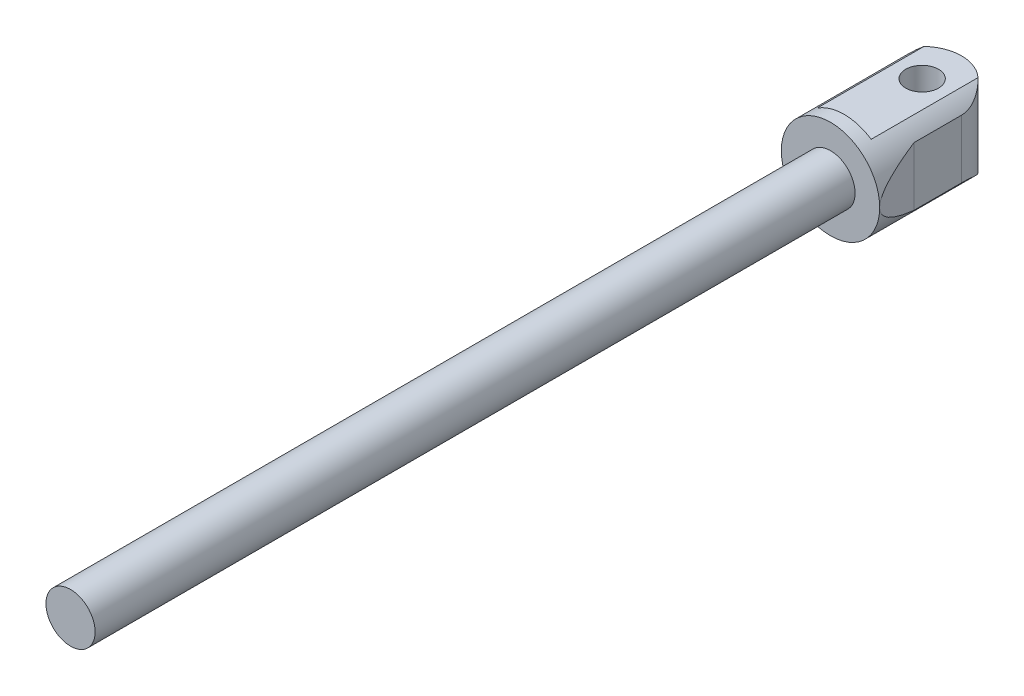
ISO-10303-21;
HEADER;
FILE_DESCRIPTION(('STEP AP214'),'2;1');
FILE_NAME('part.step','',(''),(''),'','','');
FILE_SCHEMA(('AUTOMOTIVE_DESIGN { 1 0 10303 214 1 1 1 1 }'));
ENDSEC;
DATA;
#1=APPLICATION_CONTEXT('core data for automotive mechanical design processes');
#2=APPLICATION_PROTOCOL_DEFINITION('international standard','automotive_design',2000,#1);
#3=PRODUCT_CONTEXT('',#1,'mechanical');
#4=PRODUCT('Part','Part','',(#3));
#5=PRODUCT_RELATED_PRODUCT_CATEGORY('part','',(#4));
#6=PRODUCT_DEFINITION_FORMATION('','',#4);
#7=PRODUCT_DEFINITION_CONTEXT('part definition',#1,'design');
#8=PRODUCT_DEFINITION('design','',#6,#7);
#9=PRODUCT_DEFINITION_SHAPE('','',#8);
#10=(LENGTH_UNIT() NAMED_UNIT(*) SI_UNIT(.MILLI.,.METRE.));
#11=(NAMED_UNIT(*) PLANE_ANGLE_UNIT() SI_UNIT($,.RADIAN.));
#12=(NAMED_UNIT(*) SI_UNIT($,.STERADIAN.) SOLID_ANGLE_UNIT());
#13=UNCERTAINTY_MEASURE_WITH_UNIT(LENGTH_MEASURE(1.E-05),#10,'distance_accuracy_value','');
#14=(GEOMETRIC_REPRESENTATION_CONTEXT(3) GLOBAL_UNCERTAINTY_ASSIGNED_CONTEXT((#13)) GLOBAL_UNIT_ASSIGNED_CONTEXT((#10,
#11,#12)) REPRESENTATION_CONTEXT('',''));
#15=CARTESIAN_POINT('',(0.,0.,0.));
#16=DIRECTION('',(0.,0.,1.));
#17=DIRECTION('',(1.,0.,0.));
#18=AXIS2_PLACEMENT_3D('',#15,#16,#17);
#19=CARTESIAN_POINT('',(0.,0.,-779.5));
#20=DIRECTION('',(0.,0.,1.));
#21=DIRECTION('',(1.,0.,0.));
#22=AXIS2_PLACEMENT_3D('',#19,#20,#21);
#23=CYLINDRICAL_SURFACE('',#22,75.);
#24=CARTESIAN_POINT('',(-60.24,-44.6782094538266,-719.26));
#25=CARTESIAN_POINT('',(-60.2400178079099,-44.6781600574085,-719.828290465722));
#26=CARTESIAN_POINT('',(-60.2319587873706,-44.6890508755151,-720.39656218921));
#27=CARTESIAN_POINT('',(-60.1998215340953,-44.7323463897225,-721.531764195724));
#28=CARTESIAN_POINT('',(-60.1757452688689,-44.7647484434477,-722.098694634928));
#29=CARTESIAN_POINT('',(-60.1117618498983,-44.8506276460675,-723.229097348567));
#30=CARTESIAN_POINT('',(-60.0718814338146,-44.9040691990779,-723.792573839809));
#31=CARTESIAN_POINT('',(-59.9765508624123,-45.0313181814211,-724.915865845747));
#32=CARTESIAN_POINT('',(-59.9211003342414,-45.1051260984596,-725.475681272444));
#33=CARTESIAN_POINT('',(-59.7335468937856,-45.3535736231613,-727.133059782846));
#34=CARTESIAN_POINT('',(-59.579345714394,-45.5564629679155,-728.224071832143));
#35=CARTESIAN_POINT('',(-59.2145267124964,-46.0296488247377,-730.381900273667));
#36=CARTESIAN_POINT('',(-59.0038806906372,-46.2999790250018,-731.448704282016));
#37=CARTESIAN_POINT('',(-58.4440093757804,-47.0060329056827,-733.933433028063));
#38=CARTESIAN_POINT('',(-58.0722004683523,-47.4662518580862,-735.339338651747));
#39=CARTESIAN_POINT('',(-57.2382713941835,-48.4685962338971,-738.093774649918));
#40=CARTESIAN_POINT('',(-56.7761192768603,-49.0107506189746,-739.442284519888));
#41=CARTESIAN_POINT('',(-55.7643630895057,-50.1590021187968,-742.090159337451));
#42=CARTESIAN_POINT('',(-55.2141670641873,-50.7655219627618,-743.389112144909));
#43=CARTESIAN_POINT('',(-54.0333462567749,-52.0205706439733,-745.928636163568));
#44=CARTESIAN_POINT('',(-53.4027216703069,-52.6690993790398,-747.16920751676));
#45=CARTESIAN_POINT('',(-52.2762635543612,-53.7829569582084,-749.209025319231));
#46=CARTESIAN_POINT('',(-51.8009972366958,-54.2412545453589,-750.023605457012));
#47=CARTESIAN_POINT('',(-50.8149920012892,-55.166052124261,-751.626333183248));
#48=CARTESIAN_POINT('',(-50.3042507351771,-55.6325526575018,-752.414479016673));
#49=CARTESIAN_POINT('',(-49.2476512471584,-56.5700266881361,-753.964560261676));
#50=CARTESIAN_POINT('',(-48.7017817012025,-57.0410015857711,-754.726487098517));
#51=CARTESIAN_POINT('',(-47.575401564295,-57.9837956644955,-756.223716425041));
#52=CARTESIAN_POINT('',(-46.9948917675563,-58.4556148259876,-756.959019524519));
#53=CARTESIAN_POINT('',(-45.8005633203702,-59.3960016966706,-758.401294882978));
#54=CARTESIAN_POINT('',(-45.1868095734377,-59.8645738605939,-759.108317971517));
#55=CARTESIAN_POINT('',(-43.9251392828326,-60.7963583877545,-760.49491686182));
#56=CARTESIAN_POINT('',(-43.2772221648622,-61.2595706607306,-761.174492201837));
#57=CARTESIAN_POINT('',(-41.9475850550493,-62.1775883903148,-762.505138108048));
#58=CARTESIAN_POINT('',(-41.2658769162934,-62.6323967190465,-763.156218520785));
#59=CARTESIAN_POINT('',(-39.8686242864576,-63.5309605389146,-764.42905593896));
#60=CARTESIAN_POINT('',(-39.1530782386654,-63.9747155201054,-765.050811592679));
#61=CARTESIAN_POINT('',(-37.2468461051282,-65.1117483231765,-766.629320906306));
#62=CARTESIAN_POINT('',(-36.0296742533632,-65.7942495191978,-767.562168566609));
#63=CARTESIAN_POINT('',(-33.5105744588536,-67.1123109247441,-769.342709382505));
#64=CARTESIAN_POINT('',(-32.2086502504296,-67.7478731998405,-770.190406285794));
#65=CARTESIAN_POINT('',(-29.5242213010122,-68.9600364948678,-771.792065043538));
#66=CARTESIAN_POINT('',(-28.1418050675467,-69.5367004253843,-772.5461271012));
#67=CARTESIAN_POINT('',(-25.2999860534751,-70.6202650176077,-773.952599332274));
#68=CARTESIAN_POINT('',(-23.8405962195933,-71.1271773598839,-774.605026527838));
#69=CARTESIAN_POINT('',(-21.0954994923436,-71.9840102433112,-775.701583497893));
#70=CARTESIAN_POINT('',(-19.8201988986272,-72.3460538606143,-776.162332232936));
#71=CARTESIAN_POINT('',(-17.2265455791748,-73.0070978896685,-777.000457002701));
#72=CARTESIAN_POINT('',(-15.9081972883068,-73.3061047720846,-777.377841594868));
#73=CARTESIAN_POINT('',(-13.2362654567833,-73.8353247837602,-778.043957757132));
#74=CARTESIAN_POINT('',(-11.8826965347954,-74.0655659749472,-778.332725491354));
#75=CARTESIAN_POINT('',(-9.14860208476668,-74.4527308048549,-778.817434579232));
#76=CARTESIAN_POINT('',(-7.76807623605481,-74.6096535708486,-779.013374827941));
#77=CARTESIAN_POINT('',(-4.98519133448538,-74.8472104068613,-779.309732770816));
#78=CARTESIAN_POINT('',(-3.58277168330382,-74.9275685164804,-779.409804936656));
#79=CARTESIAN_POINT('',(-0.772047765146235,-75.009203316087,-779.511465603033));
#80=CARTESIAN_POINT('',(0.636256513318073,-75.010479851615,-779.513053911214));
#81=CARTESIAN_POINT('',(3.44738130554756,-74.9339228526574,-779.417719287318));
#82=CARTESIAN_POINT('',(4.85020167031441,-74.8560871834791,-779.320793697029));
#83=CARTESIAN_POINT('',(7.63920987736579,-74.6230571785201,-779.030107990285));
#84=CARTESIAN_POINT('',(9.02539811882408,-74.4678647031341,-778.836350202599));
#85=CARTESIAN_POINT('',(11.6942336026652,-74.0942528678015,-778.368666765328));
#86=CARTESIAN_POINT('',(12.9783419864204,-73.8798453406996,-778.099818481114));
#87=CARTESIAN_POINT('',(15.5150169190735,-73.389053270928,-777.482382498886));
#88=CARTESIAN_POINT('',(16.7675849086185,-73.1126715647391,-777.133798450266));
#89=CARTESIAN_POINT('',(19.2350118305411,-72.5026196247789,-776.361170252726));
#90=CARTESIAN_POINT('',(20.4498655744625,-72.1689415494617,-775.937115774681));
#91=CARTESIAN_POINT('',(22.8366069616576,-71.4495854427753,-775.018250971808));
#92=CARTESIAN_POINT('',(24.0084920516861,-71.0639043276761,-774.523436450872));
#93=CARTESIAN_POINT('',(26.4148763715551,-70.2071026582862,-773.417442933846));
#94=CARTESIAN_POINT('',(27.6446885155893,-69.7313416984657,-772.799666840782));
#95=CARTESIAN_POINT('',(30.0442052012989,-68.7316192035966,-771.490943168662));
#96=CARTESIAN_POINT('',(31.2139065790631,-68.2076551354341,-770.799991743892));
#97=CARTESIAN_POINT('',(33.4910847100173,-67.1188541024938,-769.350193254196));
#98=CARTESIAN_POINT('',(34.5985386964319,-66.5540023537789,-768.591321607373));
#99=CARTESIAN_POINT('',(36.7492028355752,-65.3910611321773,-767.01075798669));
#100=CARTESIAN_POINT('',(37.7924098854835,-64.7929700566392,-766.189062983052));
#101=CARTESIAN_POINT('',(40.0223723413488,-63.4447737423033,-764.311177013693));
#102=CARTESIAN_POINT('',(41.1943084911169,-62.6887740221905,-763.241593271249));
#103=CARTESIAN_POINT('',(43.4425647326047,-61.1522518580056,-761.022386640751));
#104=CARTESIAN_POINT('',(44.5188691548117,-60.3717254234238,-759.872750690773));
#105=CARTESIAN_POINT('',(46.5763273607765,-58.7990141624916,-757.495810334168));
#106=CARTESIAN_POINT('',(47.5573665499669,-58.0068165838935,-756.268415251896));
#107=CARTESIAN_POINT('',(49.4217986518029,-56.4267515556741,-753.739149518499));
#108=CARTESIAN_POINT('',(50.3052028454613,-55.6388836158117,-752.43728749792));
#109=CARTESIAN_POINT('',(51.8996492451501,-54.1526375740351,-749.876267517932));
#110=CARTESIAN_POINT('',(52.6190088208818,-53.4524592129906,-748.623332632824));
#111=CARTESIAN_POINT('',(53.9725150401032,-52.0854346493448,-746.054279861048));
#112=CARTESIAN_POINT('',(54.6066504433973,-51.4185928507644,-744.738153671103));
#113=CARTESIAN_POINT('',(55.7846304354103,-50.1381159757584,-742.043585935046));
#114=CARTESIAN_POINT('',(56.3286040840631,-49.5244054579738,-740.665237118297));
#115=CARTESIAN_POINT('',(57.321139412079,-48.3721511900354,-737.844339090309));
#116=CARTESIAN_POINT('',(57.7697490469584,-47.8335697069593,-736.401822590383));
#117=CARTESIAN_POINT('',(58.4457191064089,-47.0031279088764,-733.892388728201));
#118=CARTESIAN_POINT('',(58.6992315679536,-46.6854790108299,-732.841028847432));
#119=CARTESIAN_POINT('',(59.1518217809699,-46.1106913011533,-730.710144208112));
#120=CARTESIAN_POINT('',(59.3508975267681,-45.8535547190958,-729.630618413417));
#121=CARTESIAN_POINT('',(59.6906365014733,-45.4104204996475,-727.451267133762));
#122=CARTESIAN_POINT('',(59.8314814126077,-45.2242017418217,-726.351516142372));
#123=CARTESIAN_POINT('',(59.9973427584587,-45.003632668456,-724.690155341706));
#124=CARTESIAN_POINT('',(60.0450574966451,-44.9399092841434,-724.134518285798));
#125=CARTESIAN_POINT('',(60.1251211694355,-44.8327377713292,-723.020211554776));
#126=CARTESIAN_POINT('',(60.1574721518942,-44.7892869406862,-722.461542293874));
#127=CARTESIAN_POINT('',(60.2013344133764,-44.7303073056669,-721.462392425623));
#128=CARTESIAN_POINT('',(60.215827661604,-44.7107879707551,-721.022270619038));
#129=CARTESIAN_POINT('',(60.2351632145741,-44.6847309155556,-720.141438317674));
#130=CARTESIAN_POINT('',(60.2400056620304,-44.6781930033018,-719.700727831697));
#131=CARTESIAN_POINT('',(60.24,-44.6782094538266,-719.26));
#132=B_SPLINE_CURVE_WITH_KNOTS('',3,(#24,#25,#26,#27,#28,#29,#30,#31,#32,#33,#34,#35,#36,#37,
#38,#39,#40,#41,#42,#43,#44,#45,#46,#47,#48,#49,#50,#51,#52,#53,#54,#55,#56,#57,#58,#59,#60,#61,
#62,#63,#64,#65,#66,#67,#68,#69,#70,#71,#72,#73,#74,#75,#76,#77,#78,#79,#80,#81,#82,#83,#84,#85,
#86,#87,#88,#89,#90,#91,#92,#93,#94,#95,#96,#97,#98,#99,#100,#101,#102,#103,#104,#105,#106,#107,
#108,#109,#110,#111,#112,#113,#114,#115,#116,#117,#118,#119,#120,#121,#122,#123,#124,#125,#126,
#127,#128,#129,#130,#131),.UNSPECIFIED.,.F.,.F.,(4,2,2,2,2,2,2,2,2,2,2,2,2,2,2,2,2,2,2,2,2,2,2,
2,2,2,2,2,2,2,2,2,2,2,2,2,2,2,2,2,2,2,2,2,2,2,2,2,2,2,2,2,2,4),(0.,1.70467825600666,
3.40914715318539,5.11074463561763,6.81238286911249,10.1690547530893,13.5274067378926,
18.0960912168659,22.6663943795239,27.2688272269157,31.8712488800422,35.0160037136267,
38.1609669224912,41.3069490787517,44.4528591333346,47.592834393474,50.7328624544909,
53.8717967571155,57.0108756070996,62.0415609635563,67.0720248100223,72.0970580485064,
77.1212487704394,81.3274604550504,85.5332401653047,89.7373012270587,93.9414123294897,
98.1606195330323,102.379834977388,106.599164272287,110.818392099197,114.802157722078,
118.785741050177,122.769870004199,126.754235317196,131.118584336059,135.483162836274,
139.849327415778,144.215702695104,149.483389309644,154.751937463041,160.026746623712,
165.30094568003,170.113871800534,174.927432075062,179.734041445779,184.538227978227,
187.916895025078,191.295686539215,194.663855068665,196.347306267145,198.030533013226,
199.352627904336,200.674703244482),.UNSPECIFIED.);
#133=CARTESIAN_POINT('',(-60.24,-44.6782094538266,-719.26));
#134=VERTEX_POINT('',#133);
#135=CARTESIAN_POINT('',(-41.2003774254557,-62.67,-763.207542593415));
#136=VERTEX_POINT('',#135);
#137=EDGE_CURVE('E134',#134,#136,#132,.T.);
#138=ORIENTED_EDGE('',*,*,#137,.T.);
#139=DIRECTION('',(0.,0.,1.));
#140=VECTOR('',#139,1.);
#141=CARTESIAN_POINT('',(-41.2003774254557,-62.67,-779.5));
#142=LINE('',#141,#140);
#143=CARTESIAN_POINT('',(-41.2003774254557,-62.67,-600.36));
#144=VERTEX_POINT('',#143);
#145=EDGE_CURVE('E61',#136,#144,#142,.T.);
#146=ORIENTED_EDGE('',*,*,#145,.T.);
#147=CARTESIAN_POINT('',(0.,0.,-600.36));
#148=DIRECTION('',(0.,0.,1.));
#149=DIRECTION('',(1.,0.,0.));
#150=AXIS2_PLACEMENT_3D('',#147,#148,#149);
#151=CIRCLE('',#150,75.);
#152=CARTESIAN_POINT('',(41.2003774254557,-62.67,-600.36));
#153=VERTEX_POINT('',#152);
#154=EDGE_CURVE('E11',#144,#153,#151,.T.);
#155=ORIENTED_EDGE('',*,*,#154,.T.);
#156=DIRECTION('',(0.,0.,1.));
#157=VECTOR('',#156,1.);
#158=CARTESIAN_POINT('',(41.2003774254557,-62.67,-779.5));
#159=LINE('',#158,#157);
#160=CARTESIAN_POINT('',(41.2003774254557,-62.67,-763.207542593415));
#161=VERTEX_POINT('',#160);
#162=EDGE_CURVE('E117',#153,#161,#159,.F.);
#163=ORIENTED_EDGE('',*,*,#162,.T.);
#164=CARTESIAN_POINT('',(60.24,-44.6782094538266,-719.26));
#165=VERTEX_POINT('',#164);
#166=EDGE_CURVE('E188',#161,#165,#132,.T.);
#167=ORIENTED_EDGE('',*,*,#166,.T.);
#168=DIRECTION('',(0.,0.,1.));
#169=VECTOR('',#168,1.);
#170=CARTESIAN_POINT('',(60.24,-44.6782094538266,-779.5));
#171=LINE('',#170,#169);
#172=CARTESIAN_POINT('',(60.24,-44.6782094538266,-646.55));
#173=VERTEX_POINT('',#172);
#174=EDGE_CURVE('E266',#165,#173,#171,.T.);
#175=ORIENTED_EDGE('',*,*,#174,.T.);
#176=CARTESIAN_POINT('',(0.,0.,-920.201219512196));
#177=DIRECTION('',(-0.976616950407174,0.,0.214986818613122));
#178=DIRECTION('',(0.214986818613122,0.,0.976616950407174));
#179=AXIS2_PLACEMENT_3D('',#176,#177,#178);
#180=ELLIPSE('',#179,348.85859739599,75.);
#181=CARTESIAN_POINT('',(75.,0.,-579.5));
#182=VERTEX_POINT('',#181);
#183=EDGE_CURVE('E173',#173,#182,#180,.T.);
#184=ORIENTED_EDGE('',*,*,#183,.T.);
#185=CARTESIAN_POINT('',(0.,0.,-579.5));
#186=DIRECTION('',(0.,0.,-1.));
#187=DIRECTION('',(-1.,0.,0.));
#188=AXIS2_PLACEMENT_3D('',#185,#186,#187);
#189=CIRCLE('',#188,75.);
#190=CARTESIAN_POINT('',(-75.,0.,-579.5));
#191=VERTEX_POINT('',#190);
#192=EDGE_CURVE('E254',#182,#191,#189,.T.);
#193=ORIENTED_EDGE('',*,*,#192,.T.);
#194=CARTESIAN_POINT('',(0.,0.,-920.201219512196));
#195=DIRECTION('',(0.976616950407174,0.,0.214986818613122));
#196=DIRECTION('',(-0.214986818613122,0.,0.976616950407174));
#197=AXIS2_PLACEMENT_3D('',#194,#195,#196);
#198=ELLIPSE('',#197,348.85859739599,75.);
#199=CARTESIAN_POINT('',(-60.24,-44.6782094538266,-646.55));
#200=VERTEX_POINT('',#199);
#201=EDGE_CURVE('E172',#191,#200,#198,.T.);
#202=ORIENTED_EDGE('',*,*,#201,.T.);
#203=DIRECTION('',(0.,0.,1.));
#204=VECTOR('',#203,1.);
#205=CARTESIAN_POINT('',(-60.24,-44.6782094538266,-779.5));
#206=LINE('',#205,#204);
#207=EDGE_CURVE('E251',#200,#134,#206,.F.);
#208=ORIENTED_EDGE('',*,*,#207,.T.);
#209=EDGE_LOOP('',(#138,#146,#155,#163,#167,#175,#184,#193,#202,#208));
#210=FACE_BOUND('',#209,.T.);
#211=ADVANCED_FACE('F45',(#210),#23,.T.);
#212=CARTESIAN_POINT('',(0.,0.,579.5));
#213=DIRECTION('',(0.,0.,-1.));
#214=DIRECTION('',(-1.,0.,0.));
#215=AXIS2_PLACEMENT_3D('',#212,#213,#214);
#216=CYLINDRICAL_SURFACE('',#215,37.5);
#217=CARTESIAN_POINT('',(0.,0.,579.5));
#218=DIRECTION('',(0.,0.,1.));
#219=DIRECTION('',(1.,0.,0.));
#220=AXIS2_PLACEMENT_3D('',#217,#218,#219);
#221=CIRCLE('',#220,37.5);
#222=CARTESIAN_POINT('',(37.5,0.,579.5));
#223=VERTEX_POINT('',#222);
#224=EDGE_CURVE('E243',#223,#223,#221,.T.);
#225=ORIENTED_EDGE('',*,*,#224,.F.);
#226=EDGE_LOOP('',(#225));
#227=FACE_BOUND('',#226,.T.);
#228=CARTESIAN_POINT('',(0.,0.,-579.5));
#229=DIRECTION('',(0.,0.,1.));
#230=DIRECTION('',(1.,0.,0.));
#231=AXIS2_PLACEMENT_3D('',#228,#229,#230);
#232=CIRCLE('',#231,37.5);
#233=CARTESIAN_POINT('',(37.5,0.,-579.5));
#234=VERTEX_POINT('',#233);
#235=EDGE_CURVE('E245',#234,#234,#232,.T.);
#236=ORIENTED_EDGE('',*,*,#235,.T.);
#237=EDGE_LOOP('',(#236));
#238=FACE_BOUND('',#237,.T.);
#239=ADVANCED_FACE('F47',(#227,#238),#216,.T.);
#240=CARTESIAN_POINT('',(0.,0.,579.5));
#241=DIRECTION('',(0.,0.,1.));
#242=DIRECTION('',(1.,0.,0.));
#243=AXIS2_PLACEMENT_3D('',#240,#241,#242);
#244=PLANE('',#243);
#245=ORIENTED_EDGE('',*,*,#224,.T.);
#246=EDGE_LOOP('',(#245));
#247=FACE_BOUND('',#246,.T.);
#248=ADVANCED_FACE('F227',(#247),#244,.T.);
#249=CARTESIAN_POINT('',(60.24,44.6782094538266,-719.26));
#250=CARTESIAN_POINT('',(60.2400178079099,44.6781600574085,-719.828290465722));
#251=CARTESIAN_POINT('',(60.2319587873706,44.6890508755151,-720.39656218921));
#252=CARTESIAN_POINT('',(60.1998215340953,44.7323463897225,-721.531764195724));
#253=CARTESIAN_POINT('',(60.1757452688689,44.7647484434477,-722.098694634928));
#254=CARTESIAN_POINT('',(60.1117618498983,44.8506276460675,-723.229097348567));
#255=CARTESIAN_POINT('',(60.0718814338146,44.9040691990779,-723.792573839809));
#256=CARTESIAN_POINT('',(59.9765508624123,45.0313181814211,-724.915865845747));
#257=CARTESIAN_POINT('',(59.9211003342414,45.1051260984596,-725.475681272444));
#258=CARTESIAN_POINT('',(59.7335468937856,45.3535736231613,-727.133059782846));
#259=CARTESIAN_POINT('',(59.579345714394,45.5564629679155,-728.224071832143));
#260=CARTESIAN_POINT('',(59.2145267124964,46.0296488247377,-730.381900273667));
#261=CARTESIAN_POINT('',(59.0038806906372,46.2999790250018,-731.448704282016));
#262=CARTESIAN_POINT('',(58.4440093757804,47.0060329056827,-733.933433028063));
#263=CARTESIAN_POINT('',(58.0722004683523,47.4662518580862,-735.339338651747));
#264=CARTESIAN_POINT('',(57.2382713941835,48.4685962338971,-738.093774649918));
#265=CARTESIAN_POINT('',(56.7761192768603,49.0107506189746,-739.442284519888));
#266=CARTESIAN_POINT('',(55.7643630895057,50.1590021187968,-742.090159337451));
#267=CARTESIAN_POINT('',(55.2141670641873,50.7655219627618,-743.389112144909));
#268=CARTESIAN_POINT('',(54.0333462567749,52.0205706439733,-745.928636163568));
#269=CARTESIAN_POINT('',(53.4027216703069,52.6690993790398,-747.16920751676));
#270=CARTESIAN_POINT('',(52.2762635543612,53.7829569582084,-749.209025319231));
#271=CARTESIAN_POINT('',(51.8009972366958,54.2412545453589,-750.023605457012));
#272=CARTESIAN_POINT('',(50.8149920012892,55.166052124261,-751.626333183248));
#273=CARTESIAN_POINT('',(50.3042507351771,55.6325526575018,-752.414479016673));
#274=CARTESIAN_POINT('',(49.2476512471584,56.5700266881361,-753.964560261676));
#275=CARTESIAN_POINT('',(48.7017817012025,57.0410015857711,-754.726487098517));
#276=CARTESIAN_POINT('',(47.575401564295,57.9837956644955,-756.223716425041));
#277=CARTESIAN_POINT('',(46.9948917675563,58.4556148259876,-756.959019524519));
#278=CARTESIAN_POINT('',(45.8005633203702,59.3960016966706,-758.401294882978));
#279=CARTESIAN_POINT('',(45.1868095734377,59.8645738605939,-759.108317971517));
#280=CARTESIAN_POINT('',(43.9251392828326,60.7963583877545,-760.49491686182));
#281=CARTESIAN_POINT('',(43.2772221648622,61.2595706607306,-761.174492201837));
#282=CARTESIAN_POINT('',(41.9475850550493,62.1775883903148,-762.505138108048));
#283=CARTESIAN_POINT('',(41.2658769162934,62.6323967190465,-763.156218520785));
#284=CARTESIAN_POINT('',(39.8686242864576,63.5309605389146,-764.42905593896));
#285=CARTESIAN_POINT('',(39.1530782386654,63.9747155201054,-765.050811592679));
#286=CARTESIAN_POINT('',(37.2468461051282,65.1117483231765,-766.629320906306));
#287=CARTESIAN_POINT('',(36.0296742533632,65.7942495191978,-767.562168566609));
#288=CARTESIAN_POINT('',(33.5105744588536,67.1123109247441,-769.342709382505));
#289=CARTESIAN_POINT('',(32.2086502504296,67.7478731998405,-770.190406285794));
#290=CARTESIAN_POINT('',(29.5242213010122,68.9600364948678,-771.792065043538));
#291=CARTESIAN_POINT('',(28.1418050675467,69.5367004253843,-772.5461271012));
#292=CARTESIAN_POINT('',(25.2999860534751,70.6202650176077,-773.952599332274));
#293=CARTESIAN_POINT('',(23.8405962195933,71.1271773598839,-774.605026527838));
#294=CARTESIAN_POINT('',(21.0954994923436,71.9840102433112,-775.701583497893));
#295=CARTESIAN_POINT('',(19.8201988986272,72.3460538606143,-776.162332232936));
#296=CARTESIAN_POINT('',(17.2265455791748,73.0070978896685,-777.000457002701));
#297=CARTESIAN_POINT('',(15.9081972883068,73.3061047720846,-777.377841594868));
#298=CARTESIAN_POINT('',(13.2362654567833,73.8353247837602,-778.043957757132));
#299=CARTESIAN_POINT('',(11.8826965347954,74.0655659749472,-778.332725491354));
#300=CARTESIAN_POINT('',(9.14860208476668,74.4527308048549,-778.817434579232));
#301=CARTESIAN_POINT('',(7.76807623605481,74.6096535708486,-779.013374827941));
#302=CARTESIAN_POINT('',(4.98519133448538,74.8472104068613,-779.309732770816));
#303=CARTESIAN_POINT('',(3.58277168330382,74.9275685164804,-779.409804936656));
#304=CARTESIAN_POINT('',(0.772047765146235,75.009203316087,-779.511465603033));
#305=CARTESIAN_POINT('',(-0.636256513318073,75.010479851615,-779.513053911214));
#306=CARTESIAN_POINT('',(-3.44738130554756,74.9339228526574,-779.417719287318));
#307=CARTESIAN_POINT('',(-4.85020167031441,74.8560871834791,-779.320793697029));
#308=CARTESIAN_POINT('',(-7.63920987736579,74.6230571785201,-779.030107990285));
#309=CARTESIAN_POINT('',(-9.02539811882408,74.4678647031341,-778.836350202599));
#310=CARTESIAN_POINT('',(-11.6942336026652,74.0942528678015,-778.368666765328));
#311=CARTESIAN_POINT('',(-12.9783419864204,73.8798453406996,-778.099818481114));
#312=CARTESIAN_POINT('',(-15.5150169190735,73.389053270928,-777.482382498886));
#313=CARTESIAN_POINT('',(-16.7675849086185,73.1126715647391,-777.133798450266));
#314=CARTESIAN_POINT('',(-19.2350118305411,72.5026196247789,-776.361170252726));
#315=CARTESIAN_POINT('',(-20.4498655744625,72.1689415494617,-775.937115774681));
#316=CARTESIAN_POINT('',(-22.8366069616576,71.4495854427753,-775.018250971808));
#317=CARTESIAN_POINT('',(-24.0084920516861,71.0639043276761,-774.523436450872));
#318=CARTESIAN_POINT('',(-26.4148763715551,70.2071026582862,-773.417442933846));
#319=CARTESIAN_POINT('',(-27.6446885155893,69.7313416984657,-772.799666840782));
#320=CARTESIAN_POINT('',(-30.0442052012989,68.7316192035966,-771.490943168662));
#321=CARTESIAN_POINT('',(-31.2139065790631,68.2076551354341,-770.799991743892));
#322=CARTESIAN_POINT('',(-33.4910847100173,67.1188541024938,-769.350193254196));
#323=CARTESIAN_POINT('',(-34.5985386964319,66.5540023537789,-768.591321607373));
#324=CARTESIAN_POINT('',(-36.7492028355752,65.3910611321773,-767.01075798669));
#325=CARTESIAN_POINT('',(-37.7924098854835,64.7929700566392,-766.189062983052));
#326=CARTESIAN_POINT('',(-40.0223723413488,63.4447737423033,-764.311177013693));
#327=CARTESIAN_POINT('',(-41.1943084911169,62.6887740221905,-763.241593271249));
#328=CARTESIAN_POINT('',(-43.4425647326047,61.1522518580056,-761.022386640751));
#329=CARTESIAN_POINT('',(-44.5188691548117,60.3717254234238,-759.872750690773));
#330=CARTESIAN_POINT('',(-46.5763273607765,58.7990141624916,-757.495810334168));
#331=CARTESIAN_POINT('',(-47.5573665499669,58.0068165838935,-756.268415251896));
#332=CARTESIAN_POINT('',(-49.4217986518029,56.4267515556741,-753.739149518499));
#333=CARTESIAN_POINT('',(-50.3052028454613,55.6388836158117,-752.43728749792));
#334=CARTESIAN_POINT('',(-51.8996492451501,54.1526375740351,-749.876267517932));
#335=CARTESIAN_POINT('',(-52.6190088208818,53.4524592129906,-748.623332632824));
#336=CARTESIAN_POINT('',(-53.9725150401032,52.0854346493448,-746.054279861048));
#337=CARTESIAN_POINT('',(-54.6066504433973,51.4185928507644,-744.738153671103));
#338=CARTESIAN_POINT('',(-55.7846304354103,50.1381159757584,-742.043585935046));
#339=CARTESIAN_POINT('',(-56.3286040840631,49.5244054579738,-740.665237118297));
#340=CARTESIAN_POINT('',(-57.321139412079,48.3721511900354,-737.844339090309));
#341=CARTESIAN_POINT('',(-57.7697490469584,47.8335697069593,-736.401822590383));
#342=CARTESIAN_POINT('',(-58.4457191064089,47.0031279088764,-733.892388728201));
#343=CARTESIAN_POINT('',(-58.6992315679536,46.6854790108299,-732.841028847432));
#344=CARTESIAN_POINT('',(-59.1518217809699,46.1106913011533,-730.710144208112));
#345=CARTESIAN_POINT('',(-59.3508975267681,45.8535547190958,-729.630618413417));
#346=CARTESIAN_POINT('',(-59.6906365014733,45.4104204996475,-727.451267133762));
#347=CARTESIAN_POINT('',(-59.8314814126077,45.2242017418217,-726.351516142372));
#348=CARTESIAN_POINT('',(-59.9973427584587,45.003632668456,-724.690155341706));
#349=CARTESIAN_POINT('',(-60.0450574966451,44.9399092841434,-724.134518285798));
#350=CARTESIAN_POINT('',(-60.1251211694355,44.8327377713292,-723.020211554776));
#351=CARTESIAN_POINT('',(-60.1574721518942,44.7892869406862,-722.461542293874));
#352=CARTESIAN_POINT('',(-60.2013344133764,44.7303073056669,-721.462392425623));
#353=CARTESIAN_POINT('',(-60.215827661604,44.7107879707551,-721.022270619038));
#354=CARTESIAN_POINT('',(-60.2351632145741,44.6847309155556,-720.141438317674));
#355=CARTESIAN_POINT('',(-60.2400056620304,44.6781930033018,-719.700727831697));
#356=CARTESIAN_POINT('',(-60.24,44.6782094538266,-719.26));
#357=B_SPLINE_CURVE_WITH_KNOTS('',3,(#249,#250,#251,#252,#253,#254,#255,#256,#257,#258,#259,
#260,#261,#262,#263,#264,#265,#266,#267,#268,#269,#270,#271,#272,#273,#274,#275,#276,#277,#278,
#279,#280,#281,#282,#283,#284,#285,#286,#287,#288,#289,#290,#291,#292,#293,#294,#295,#296,#297,
#298,#299,#300,#301,#302,#303,#304,#305,#306,#307,#308,#309,#310,#311,#312,#313,#314,#315,#316,
#317,#318,#319,#320,#321,#322,#323,#324,#325,#326,#327,#328,#329,#330,#331,#332,#333,#334,#335,
#336,#337,#338,#339,#340,#341,#342,#343,#344,#345,#346,#347,#348,#349,#350,#351,#352,#353,#354,
#355,#356),.UNSPECIFIED.,.F.,.F.,(4,2,2,2,2,2,2,2,2,2,2,2,2,2,2,2,2,2,2,2,2,2,2,2,2,2,2,2,2,2,2,
2,2,2,2,2,2,2,2,2,2,2,2,2,2,2,2,2,2,2,2,2,2,4),(0.,1.70467825600666,3.40914715318539,
5.11074463561763,6.81238286911249,10.1690547530893,13.5274067378926,18.0960912168659,
22.6663943795239,27.2688272269157,31.8712488800422,35.0160037136267,38.1609669224912,
41.3069490787517,44.4528591333346,47.592834393474,50.7328624544909,53.8717967571155,
57.0108756070996,62.0415609635563,67.0720248100223,72.0970580485064,77.1212487704394,
81.3274604550504,85.5332401653047,89.7373012270587,93.9414123294897,98.1606195330323,
102.379834977388,106.599164272287,110.818392099197,114.802157722078,118.785741050177,
122.769870004199,126.754235317196,131.118584336059,135.483162836274,139.849327415778,
144.215702695104,149.483389309644,154.751937463041,160.026746623712,165.30094568003,
170.113871800534,174.927432075062,179.734041445779,184.538227978227,187.916895025078,
191.295686539215,194.663855068665,196.347306267145,198.030533013226,199.352627904336,
200.674703244482),.UNSPECIFIED.);
#358=CARTESIAN_POINT('',(60.24,44.6782094538266,-719.26));
#359=VERTEX_POINT('',#358);
#360=CARTESIAN_POINT('',(41.2003774254557,62.67,-763.207542593415));
#361=VERTEX_POINT('',#360);
#362=EDGE_CURVE('E178',#359,#361,#357,.T.);
#363=ORIENTED_EDGE('',*,*,#362,.T.);
#364=DIRECTION('',(0.,0.,1.));
#365=VECTOR('',#364,1.);
#366=CARTESIAN_POINT('',(41.2003774254557,62.67,-779.5));
#367=LINE('',#366,#365);
#368=CARTESIAN_POINT('',(41.2003774254557,62.67,-600.36));
#369=VERTEX_POINT('',#368);
#370=EDGE_CURVE('E69',#361,#369,#367,.T.);
#371=ORIENTED_EDGE('',*,*,#370,.T.);
#372=CARTESIAN_POINT('',(0.,0.,-600.36));
#373=DIRECTION('',(0.,0.,1.));
#374=DIRECTION('',(1.,0.,0.));
#375=AXIS2_PLACEMENT_3D('',#372,#373,#374);
#376=CIRCLE('',#375,75.);
#377=CARTESIAN_POINT('',(-41.2003774254557,62.67,-600.36));
#378=VERTEX_POINT('',#377);
#379=EDGE_CURVE('E54',#369,#378,#376,.T.);
#380=ORIENTED_EDGE('',*,*,#379,.T.);
#381=DIRECTION('',(0.,0.,1.));
#382=VECTOR('',#381,1.);
#383=CARTESIAN_POINT('',(-41.2003774254557,62.67,-779.5));
#384=LINE('',#383,#382);
#385=CARTESIAN_POINT('',(-41.2003774254557,62.67,-763.207542593415));
#386=VERTEX_POINT('',#385);
#387=EDGE_CURVE('E140',#378,#386,#384,.F.);
#388=ORIENTED_EDGE('',*,*,#387,.T.);
#389=CARTESIAN_POINT('',(-60.24,44.6782094538266,-719.26));
#390=VERTEX_POINT('',#389);
#391=EDGE_CURVE('E189',#386,#390,#357,.T.);
#392=ORIENTED_EDGE('',*,*,#391,.T.);
#393=DIRECTION('',(0.,0.,1.));
#394=VECTOR('',#393,1.);
#395=CARTESIAN_POINT('',(-60.24,44.6782094538266,-779.5));
#396=LINE('',#395,#394);
#397=CARTESIAN_POINT('',(-60.24,44.6782094538266,-646.55));
#398=VERTEX_POINT('',#397);
#399=EDGE_CURVE('E258',#390,#398,#396,.T.);
#400=ORIENTED_EDGE('',*,*,#399,.T.);
#401=EDGE_CURVE('E157',#398,#191,#198,.T.);
#402=ORIENTED_EDGE('',*,*,#401,.T.);
#403=EDGE_CURVE('E247',#191,#182,#189,.T.);
#404=ORIENTED_EDGE('',*,*,#403,.T.);
#405=CARTESIAN_POINT('',(60.24,44.6782094538266,-646.55));
#406=VERTEX_POINT('',#405);
#407=EDGE_CURVE('E177',#182,#406,#180,.T.);
#408=ORIENTED_EDGE('',*,*,#407,.T.);
#409=DIRECTION('',(0.,0.,1.));
#410=VECTOR('',#409,1.);
#411=CARTESIAN_POINT('',(60.24,44.6782094538266,-779.5));
#412=LINE('',#411,#410);
#413=EDGE_CURVE('E262',#406,#359,#412,.F.);
#414=ORIENTED_EDGE('',*,*,#413,.T.);
#415=EDGE_LOOP('',(#363,#371,#380,#388,#392,#400,#402,#404,#408,#414));
#416=FACE_BOUND('',#415,.T.);
#417=ADVANCED_FACE('F195',(#416),#23,.T.);
#418=CARTESIAN_POINT('',(0.,0.,-579.5));
#419=DIRECTION('',(0.,0.,-1.));
#420=DIRECTION('',(-1.,0.,0.));
#421=AXIS2_PLACEMENT_3D('',#418,#419,#420);
#422=PLANE('',#421);
#423=ORIENTED_EDGE('',*,*,#235,.F.);
#424=EDGE_LOOP('',(#423));
#425=FACE_BOUND('',#424,.T.);
#426=ORIENTED_EDGE('',*,*,#403,.F.);
#427=ORIENTED_EDGE('',*,*,#192,.F.);
#428=EDGE_LOOP('',(#426,#427));
#429=FACE_BOUND('',#428,.T.);
#430=ADVANCED_FACE('F211',(#425,#429),#422,.F.);
#431=CARTESIAN_POINT('',(60.24,-75.,-646.55));
#432=DIRECTION('',(-1.,0.,0.));
#433=DIRECTION('',(0.,0.,1.));
#434=AXIS2_PLACEMENT_3D('',#431,#432,#433);
#435=PLANE('',#434);
#436=DIRECTION('',(0.,1.,0.));
#437=VECTOR('',#436,1.);
#438=CARTESIAN_POINT('',(60.24,-75.,-719.26));
#439=LINE('',#438,#437);
#440=EDGE_CURVE('E162',#165,#359,#439,.T.);
#441=ORIENTED_EDGE('',*,*,#440,.T.);
#442=ORIENTED_EDGE('',*,*,#413,.F.);
#443=DIRECTION('',(0.,1.,0.));
#444=VECTOR('',#443,1.);
#445=CARTESIAN_POINT('',(60.24,-75.,-646.55));
#446=LINE('',#445,#444);
#447=EDGE_CURVE('E152',#173,#406,#446,.T.);
#448=ORIENTED_EDGE('',*,*,#447,.F.);
#449=ORIENTED_EDGE('',*,*,#174,.F.);
#450=EDGE_LOOP('',(#441,#442,#448,#449));
#451=FACE_BOUND('',#450,.T.);
#452=ADVANCED_FACE('F207',(#451),#435,.F.);
#453=CARTESIAN_POINT('',(-60.24,-75.,-646.55));
#454=DIRECTION('',(1.,0.,0.));
#455=DIRECTION('',(0.,0.,-1.));
#456=AXIS2_PLACEMENT_3D('',#453,#454,#455);
#457=PLANE('',#456);
#458=DIRECTION('',(0.,1.,0.));
#459=VECTOR('',#458,1.);
#460=CARTESIAN_POINT('',(-60.24,-75.,-719.26));
#461=LINE('',#460,#459);
#462=EDGE_CURVE('E158',#134,#390,#461,.T.);
#463=ORIENTED_EDGE('',*,*,#462,.F.);
#464=ORIENTED_EDGE('',*,*,#207,.F.);
#465=DIRECTION('',(0.,1.,0.));
#466=VECTOR('',#465,1.);
#467=CARTESIAN_POINT('',(-60.24,-75.,-646.55));
#468=LINE('',#467,#466);
#469=EDGE_CURVE('E153',#200,#398,#468,.T.);
#470=ORIENTED_EDGE('',*,*,#469,.T.);
#471=ORIENTED_EDGE('',*,*,#399,.F.);
#472=EDGE_LOOP('',(#463,#464,#470,#471));
#473=FACE_BOUND('',#472,.T.);
#474=ADVANCED_FACE('F204',(#473),#457,.F.);
#475=CARTESIAN_POINT('',(0.,-75.,-719.26));
#476=DIRECTION('',(0.,1.,0.));
#477=DIRECTION('',(0.,0.,1.));
#478=AXIS2_PLACEMENT_3D('',#475,#476,#477);
#479=CYLINDRICAL_SURFACE('',#478,60.24);
#480=ORIENTED_EDGE('',*,*,#391,.F.);
#481=CARTESIAN_POINT('',(0.,62.67,-719.26));
#482=DIRECTION('',(0.,-1.,0.));
#483=DIRECTION('',(0.,0.,-1.));
#484=AXIS2_PLACEMENT_3D('',#481,#482,#483);
#485=CIRCLE('',#484,60.24);
#486=EDGE_CURVE('E272',#386,#361,#485,.T.);
#487=ORIENTED_EDGE('',*,*,#486,.T.);
#488=ORIENTED_EDGE('',*,*,#362,.F.);
#489=ORIENTED_EDGE('',*,*,#440,.F.);
#490=ORIENTED_EDGE('',*,*,#166,.F.);
#491=CARTESIAN_POINT('',(0.,-62.67,-719.26));
#492=DIRECTION('',(0.,1.,0.));
#493=DIRECTION('',(0.,0.,1.));
#494=AXIS2_PLACEMENT_3D('',#491,#492,#493);
#495=CIRCLE('',#494,60.24);
#496=EDGE_CURVE('E122',#161,#136,#495,.T.);
#497=ORIENTED_EDGE('',*,*,#496,.T.);
#498=ORIENTED_EDGE('',*,*,#137,.F.);
#499=ORIENTED_EDGE('',*,*,#462,.T.);
#500=EDGE_LOOP('',(#480,#487,#488,#489,#490,#497,#498,#499));
#501=FACE_BOUND('',#500,.T.);
#502=ADVANCED_FACE('F198',(#501),#479,.T.);
#503=CARTESIAN_POINT('',(75.,-75.,-579.5));
#504=DIRECTION('',(-0.976616950407174,0.,0.214986818613122));
#505=DIRECTION('',(0.214986818613122,0.,0.976616950407174));
#506=AXIS2_PLACEMENT_3D('',#503,#504,#505);
#507=PLANE('',#506);
#508=ORIENTED_EDGE('',*,*,#183,.F.);
#509=ORIENTED_EDGE('',*,*,#447,.T.);
#510=ORIENTED_EDGE('',*,*,#407,.F.);
#511=EDGE_LOOP('',(#508,#509,#510));
#512=FACE_BOUND('',#511,.T.);
#513=ADVANCED_FACE('F203',(#512),#507,.F.);
#514=CARTESIAN_POINT('',(-75.,-75.,-579.5));
#515=DIRECTION('',(0.976616950407174,0.,0.214986818613122));
#516=DIRECTION('',(0.214986818613122,0.,-0.976616950407174));
#517=AXIS2_PLACEMENT_3D('',#514,#515,#516);
#518=PLANE('',#517);
#519=ORIENTED_EDGE('',*,*,#401,.F.);
#520=ORIENTED_EDGE('',*,*,#469,.F.);
#521=ORIENTED_EDGE('',*,*,#201,.F.);
#522=EDGE_LOOP('',(#519,#520,#521));
#523=FACE_BOUND('',#522,.T.);
#524=ADVANCED_FACE('F215',(#523),#518,.F.);
#525=CARTESIAN_POINT('',(75.,-102.493422948503,-600.36));
#526=DIRECTION('',(0.,0.,1.));
#527=DIRECTION('',(1.,0.,0.));
#528=AXIS2_PLACEMENT_3D('',#525,#526,#527);
#529=PLANE('',#528);
#530=DIRECTION('',(-1.,0.,0.));
#531=VECTOR('',#530,1.);
#532=CARTESIAN_POINT('',(75.,-62.67,-600.36));
#533=LINE('',#532,#531);
#534=EDGE_CURVE('E121',#153,#144,#533,.T.);
#535=ORIENTED_EDGE('',*,*,#534,.F.);
#536=ORIENTED_EDGE('',*,*,#154,.F.);
#537=EDGE_LOOP('',(#535,#536));
#538=FACE_BOUND('',#537,.T.);
#539=ADVANCED_FACE('F129',(#538),#529,.F.);
#540=CARTESIAN_POINT('',(75.,-62.67,-822.574700052647));
#541=DIRECTION('',(0.,1.,0.));
#542=DIRECTION('',(0.,0.,1.));
#543=AXIS2_PLACEMENT_3D('',#540,#541,#542);
#544=PLANE('',#543);
#545=ORIENTED_EDGE('',*,*,#496,.F.);
#546=ORIENTED_EDGE('',*,*,#162,.F.);
#547=ORIENTED_EDGE('',*,*,#534,.T.);
#548=ORIENTED_EDGE('',*,*,#145,.F.);
#549=EDGE_LOOP('',(#545,#546,#547,#548));
#550=FACE_BOUND('',#549,.T.);
#551=CARTESIAN_POINT('',(0.,-62.67,-719.26));
#552=DIRECTION('',(0.,1.,0.));
#553=DIRECTION('',(0.,0.,1.));
#554=AXIS2_PLACEMENT_3D('',#551,#552,#553);
#555=CIRCLE('',#554,25.);
#556=CARTESIAN_POINT('',(0.,-62.67,-694.26));
#557=VERTEX_POINT('',#556);
#558=EDGE_CURVE('E136',#557,#557,#555,.F.);
#559=ORIENTED_EDGE('',*,*,#558,.F.);
#560=EDGE_LOOP('',(#559));
#561=FACE_BOUND('',#560,.T.);
#562=ADVANCED_FACE('F119',(#550,#561),#544,.F.);
#563=CARTESIAN_POINT('',(75.,102.493422948503,-600.36));
#564=DIRECTION('',(0.,0.,1.));
#565=DIRECTION('',(1.,0.,0.));
#566=AXIS2_PLACEMENT_3D('',#563,#564,#565);
#567=PLANE('',#566);
#568=DIRECTION('',(-1.,0.,0.));
#569=VECTOR('',#568,1.);
#570=CARTESIAN_POINT('',(75.,62.67,-600.36));
#571=LINE('',#570,#569);
#572=EDGE_CURVE('E126',#369,#378,#571,.T.);
#573=ORIENTED_EDGE('',*,*,#572,.T.);
#574=ORIENTED_EDGE('',*,*,#379,.F.);
#575=EDGE_LOOP('',(#573,#574));
#576=FACE_BOUND('',#575,.T.);
#577=ADVANCED_FACE('F279',(#576),#567,.F.);
#578=CARTESIAN_POINT('',(75.,62.67,-822.574700052647));
#579=DIRECTION('',(0.,-1.,0.));
#580=DIRECTION('',(0.,0.,-1.));
#581=AXIS2_PLACEMENT_3D('',#578,#579,#580);
#582=PLANE('',#581);
#583=ORIENTED_EDGE('',*,*,#486,.F.);
#584=ORIENTED_EDGE('',*,*,#387,.F.);
#585=ORIENTED_EDGE('',*,*,#572,.F.);
#586=ORIENTED_EDGE('',*,*,#370,.F.);
#587=EDGE_LOOP('',(#583,#584,#585,#586));
#588=FACE_BOUND('',#587,.T.);
#589=CARTESIAN_POINT('',(0.,62.67,-719.26));
#590=DIRECTION('',(0.,-1.,0.));
#591=DIRECTION('',(0.,0.,-1.));
#592=AXIS2_PLACEMENT_3D('',#589,#590,#591);
#593=CIRCLE('',#592,25.);
#594=CARTESIAN_POINT('',(0.,62.67,-744.26));
#595=VERTEX_POINT('',#594);
#596=EDGE_CURVE('E148',#595,#595,#593,.F.);
#597=ORIENTED_EDGE('',*,*,#596,.F.);
#598=EDGE_LOOP('',(#597));
#599=FACE_BOUND('',#598,.T.);
#600=ADVANCED_FACE('F219',(#588,#599),#582,.F.);
#601=CARTESIAN_POINT('',(0.,-75.,-719.26));
#602=DIRECTION('',(0.,1.,0.));
#603=DIRECTION('',(0.,0.,1.));
#604=AXIS2_PLACEMENT_3D('',#601,#602,#603);
#605=CYLINDRICAL_SURFACE('',#604,25.);
#606=ORIENTED_EDGE('',*,*,#596,.T.);
#607=EDGE_LOOP('',(#606));
#608=FACE_BOUND('',#607,.T.);
#609=ORIENTED_EDGE('',*,*,#558,.T.);
#610=EDGE_LOOP('',(#609));
#611=FACE_BOUND('',#610,.T.);
#612=ADVANCED_FACE('F217',(#608,#611),#605,.F.);
#613=CLOSED_SHELL('',(#211,#239,#248,#417,#430,#452,#474,#502,#513,#524,#539,#562,#577,#600,#612));
#614=MANIFOLD_SOLID_BREP('B2',#613);
#615=ADVANCED_BREP_SHAPE_REPRESENTATION('',(#18,#614),#14);
#616=SHAPE_DEFINITION_REPRESENTATION(#9,#615);
ENDSEC;
END-ISO-10303-21;
